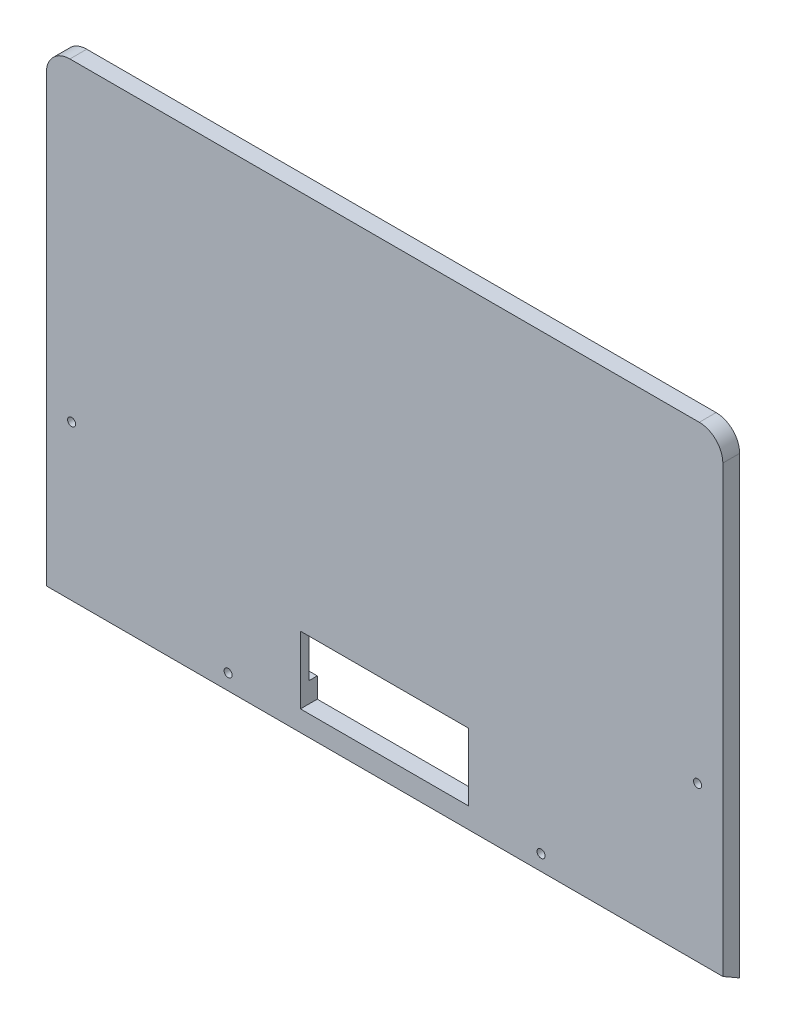
ISO-10303-21;
HEADER;
FILE_DESCRIPTION(('STEP AP214'),'2;1');
FILE_NAME('part.step','',(''),(''),'','','');
FILE_SCHEMA(('AUTOMOTIVE_DESIGN { 1 0 10303 214 1 1 1 1 }'));
ENDSEC;
DATA;
#1=APPLICATION_CONTEXT('core data for automotive mechanical design processes');
#2=APPLICATION_PROTOCOL_DEFINITION('international standard','automotive_design',2000,#1);
#3=PRODUCT_CONTEXT('',#1,'mechanical');
#4=PRODUCT('Part','Part','',(#3));
#5=PRODUCT_RELATED_PRODUCT_CATEGORY('part','',(#4));
#6=PRODUCT_DEFINITION_FORMATION('','',#4);
#7=PRODUCT_DEFINITION_CONTEXT('part definition',#1,'design');
#8=PRODUCT_DEFINITION('design','',#6,#7);
#9=PRODUCT_DEFINITION_SHAPE('','',#8);
#10=(LENGTH_UNIT() NAMED_UNIT(*) SI_UNIT(.MILLI.,.METRE.));
#11=(NAMED_UNIT(*) PLANE_ANGLE_UNIT() SI_UNIT($,.RADIAN.));
#12=(NAMED_UNIT(*) SI_UNIT($,.STERADIAN.) SOLID_ANGLE_UNIT());
#13=UNCERTAINTY_MEASURE_WITH_UNIT(LENGTH_MEASURE(1.E-05),#10,'distance_accuracy_value','');
#14=(GEOMETRIC_REPRESENTATION_CONTEXT(3) GLOBAL_UNCERTAINTY_ASSIGNED_CONTEXT((#13)) GLOBAL_UNIT_ASSIGNED_CONTEXT((#10,
#11,#12)) REPRESENTATION_CONTEXT('',''));
#15=CARTESIAN_POINT('',(0.,0.,0.));
#16=DIRECTION('',(0.,0.,1.));
#17=DIRECTION('',(1.,0.,0.));
#18=AXIS2_PLACEMENT_3D('',#15,#16,#17);
#19=CARTESIAN_POINT('',(0.,0.,0.));
#20=DIRECTION('',(0.,0.,1.));
#21=DIRECTION('',(1.,0.,0.));
#22=AXIS2_PLACEMENT_3D('',#19,#20,#21);
#23=PLANE('',#22);
#24=CARTESIAN_POINT('',(92.9999999999983,-22.1704481239277,0.));
#25=DIRECTION('',(0.,0.,-1.));
#26=DIRECTION('',(-1.,0.,0.));
#27=AXIS2_PLACEMENT_3D('',#24,#25,#26);
#28=CIRCLE('',#27,2.25);
#29=CARTESIAN_POINT('',(90.7499999999983,-22.1704481239277,0.));
#30=VERTEX_POINT('',#29);
#31=EDGE_CURVE('E737',#30,#30,#28,.T.);
#32=ORIENTED_EDGE('',*,*,#31,.F.);
#33=EDGE_LOOP('',(#32));
#34=FACE_BOUND('',#33,.T.);
#35=CARTESIAN_POINT('',(46.4999999999983,-63.4999999999987,0.));
#36=DIRECTION('',(0.,0.,-1.));
#37=DIRECTION('',(-1.,0.,0.));
#38=AXIS2_PLACEMENT_3D('',#35,#36,#37);
#39=CIRCLE('',#38,2.25);
#40=CARTESIAN_POINT('',(44.2499999999983,-63.4999999999987,0.));
#41=VERTEX_POINT('',#40);
#42=EDGE_CURVE('E730',#41,#41,#39,.T.);
#43=ORIENTED_EDGE('',*,*,#42,.F.);
#44=EDGE_LOOP('',(#43));
#45=FACE_BOUND('',#44,.T.);
#46=CARTESIAN_POINT('',(-46.5000000000017,-63.4999999999974,0.));
#47=DIRECTION('',(0.,0.,-1.));
#48=DIRECTION('',(-1.,0.,0.));
#49=AXIS2_PLACEMENT_3D('',#46,#47,#48);
#50=CIRCLE('',#49,2.25);
#51=CARTESIAN_POINT('',(-48.7500000000017,-63.4999999999974,0.));
#52=VERTEX_POINT('',#51);
#53=EDGE_CURVE('E748',#52,#52,#50,.T.);
#54=ORIENTED_EDGE('',*,*,#53,.F.);
#55=EDGE_LOOP('',(#54));
#56=FACE_BOUND('',#55,.T.);
#57=CARTESIAN_POINT('',(92.9999999999983,-63.5,0.));
#58=DIRECTION('',(0.,0.,-1.));
#59=DIRECTION('',(-1.,0.,0.));
#60=AXIS2_PLACEMENT_3D('',#57,#58,#59);
#61=CIRCLE('',#60,1.2);
#62=CARTESIAN_POINT('',(91.7999999999983,-63.5,0.));
#63=VERTEX_POINT('',#62);
#64=EDGE_CURVE('E344',#63,#63,#61,.T.);
#65=ORIENTED_EDGE('',*,*,#64,.F.);
#66=EDGE_LOOP('',(#65));
#67=FACE_BOUND('',#66,.T.);
#68=CARTESIAN_POINT('',(-93.0000000000017,-63.4999999999974,0.));
#69=DIRECTION('',(0.,0.,-1.));
#70=DIRECTION('',(-1.,0.,0.));
#71=AXIS2_PLACEMENT_3D('',#68,#69,#70);
#72=CIRCLE('',#71,1.2);
#73=CARTESIAN_POINT('',(-94.2000000000017,-63.4999999999974,0.));
#74=VERTEX_POINT('',#73);
#75=EDGE_CURVE('E363',#74,#74,#72,.T.);
#76=ORIENTED_EDGE('',*,*,#75,.F.);
#77=EDGE_LOOP('',(#76));
#78=FACE_BOUND('',#77,.T.);
#79=CARTESIAN_POINT('',(-93.,63.5000000000026,0.));
#80=DIRECTION('',(0.,0.,-1.));
#81=DIRECTION('',(-1.,0.,0.));
#82=AXIS2_PLACEMENT_3D('',#79,#80,#81);
#83=CIRCLE('',#82,1.2);
#84=CARTESIAN_POINT('',(-94.2,63.5000000000026,0.));
#85=VERTEX_POINT('',#84);
#86=EDGE_CURVE('E355',#85,#85,#83,.T.);
#87=ORIENTED_EDGE('',*,*,#86,.F.);
#88=EDGE_LOOP('',(#87));
#89=FACE_BOUND('',#88,.T.);
#90=CARTESIAN_POINT('',(93.,63.5,0.));
#91=DIRECTION('',(0.,0.,-1.));
#92=DIRECTION('',(-1.,0.,0.));
#93=AXIS2_PLACEMENT_3D('',#90,#91,#92);
#94=CIRCLE('',#93,1.2);
#95=CARTESIAN_POINT('',(91.8,63.5,0.));
#96=VERTEX_POINT('',#95);
#97=EDGE_CURVE('E354',#96,#96,#94,.T.);
#98=ORIENTED_EDGE('',*,*,#97,.F.);
#99=EDGE_LOOP('',(#98));
#100=FACE_BOUND('',#99,.T.);
#101=DIRECTION('',(-1.,0.,0.));
#102=VECTOR('',#101,1.);
#103=CARTESIAN_POINT('',(-100.5,71.,0.));
#104=LINE('',#103,#102);
#105=CARTESIAN_POINT('',(93.5000000000001,71.,0.));
#106=VERTEX_POINT('',#105);
#107=CARTESIAN_POINT('',(-93.4999999999999,71.,0.));
#108=VERTEX_POINT('',#107);
#109=EDGE_CURVE('E184',#106,#108,#104,.T.);
#110=ORIENTED_EDGE('',*,*,#109,.F.);
#111=CARTESIAN_POINT('',(93.5000000000001,64.,0.));
#112=DIRECTION('',(0.,0.,1.));
#113=DIRECTION('',(1.,0.,0.));
#114=AXIS2_PLACEMENT_3D('',#111,#112,#113);
#115=CIRCLE('',#114,7.);
#116=CARTESIAN_POINT('',(100.5,64.,0.));
#117=VERTEX_POINT('',#116);
#118=EDGE_CURVE('E182',#106,#117,#115,.F.);
#119=ORIENTED_EDGE('',*,*,#118,.T.);
#120=DIRECTION('',(0.,1.,0.));
#121=VECTOR('',#120,1.);
#122=CARTESIAN_POINT('',(100.5,71.,0.));
#123=LINE('',#122,#121);
#124=CARTESIAN_POINT('',(100.5,-71.,0.));
#125=VERTEX_POINT('',#124);
#126=EDGE_CURVE('E176',#125,#117,#123,.T.);
#127=ORIENTED_EDGE('',*,*,#126,.F.);
#128=DIRECTION('',(1.,0.,0.));
#129=VECTOR('',#128,1.);
#130=CARTESIAN_POINT('',(-100.5,-71.,0.));
#131=LINE('',#130,#129);
#132=CARTESIAN_POINT('',(-100.5,-71.,0.));
#133=VERTEX_POINT('',#132);
#134=EDGE_CURVE('E160',#133,#125,#131,.T.);
#135=ORIENTED_EDGE('',*,*,#134,.F.);
#136=DIRECTION('',(0.,-1.,0.));
#137=VECTOR('',#136,1.);
#138=CARTESIAN_POINT('',(-100.5,71.,0.));
#139=LINE('',#138,#137);
#140=CARTESIAN_POINT('',(-100.5,64.,0.));
#141=VERTEX_POINT('',#140);
#142=EDGE_CURVE('E173',#141,#133,#139,.T.);
#143=ORIENTED_EDGE('',*,*,#142,.F.);
#144=CARTESIAN_POINT('',(-93.4999999999999,64.,0.));
#145=DIRECTION('',(0.,0.,1.));
#146=DIRECTION('',(1.,0.,0.));
#147=AXIS2_PLACEMENT_3D('',#144,#145,#146);
#148=CIRCLE('',#147,7.);
#149=EDGE_CURVE('E220',#141,#108,#148,.F.);
#150=ORIENTED_EDGE('',*,*,#149,.T.);
#151=EDGE_LOOP('',(#110,#119,#127,#135,#143,#150));
#152=FACE_BOUND('',#151,.T.);
#153=DIRECTION('',(0.,1.,0.));
#154=VECTOR('',#153,1.);
#155=CARTESIAN_POINT('',(25.,-62.,0.));
#156=LINE('',#155,#154);
#157=CARTESIAN_POINT('',(25.,-62.,0.));
#158=VERTEX_POINT('',#157);
#159=CARTESIAN_POINT('',(25.,-56.,0.));
#160=VERTEX_POINT('',#159);
#161=EDGE_CURVE('E378',#158,#160,#156,.T.);
#162=ORIENTED_EDGE('',*,*,#161,.T.);
#163=DIRECTION('',(1.,0.,0.));
#164=VECTOR('',#163,1.);
#165=CARTESIAN_POINT('',(-85.5,-56.,0.));
#166=LINE('',#165,#164);
#167=CARTESIAN_POINT('',(85.5,-56.,0.));
#168=VERTEX_POINT('',#167);
#169=EDGE_CURVE('E321',#160,#168,#166,.T.);
#170=ORIENTED_EDGE('',*,*,#169,.T.);
#171=DIRECTION('',(0.,1.,0.));
#172=VECTOR('',#171,1.);
#173=CARTESIAN_POINT('',(85.5,56.,0.));
#174=LINE('',#173,#172);
#175=CARTESIAN_POINT('',(85.5,56.,0.));
#176=VERTEX_POINT('',#175);
#177=EDGE_CURVE('E308',#168,#176,#174,.T.);
#178=ORIENTED_EDGE('',*,*,#177,.T.);
#179=DIRECTION('',(-1.,0.,0.));
#180=VECTOR('',#179,1.);
#181=CARTESIAN_POINT('',(-85.5,56.,0.));
#182=LINE('',#181,#180);
#183=CARTESIAN_POINT('',(-85.5,56.,0.));
#184=VERTEX_POINT('',#183);
#185=EDGE_CURVE('E316',#176,#184,#182,.T.);
#186=ORIENTED_EDGE('',*,*,#185,.T.);
#187=DIRECTION('',(0.,-1.,0.));
#188=VECTOR('',#187,1.);
#189=CARTESIAN_POINT('',(-85.5,56.,0.));
#190=LINE('',#189,#188);
#191=CARTESIAN_POINT('',(-85.5,-56.,0.));
#192=VERTEX_POINT('',#191);
#193=EDGE_CURVE('E435',#184,#192,#190,.T.);
#194=ORIENTED_EDGE('',*,*,#193,.T.);
#195=CARTESIAN_POINT('',(-25.,-56.,0.));
#196=VERTEX_POINT('',#195);
#197=EDGE_CURVE('E334',#192,#196,#166,.T.);
#198=ORIENTED_EDGE('',*,*,#197,.T.);
#199=DIRECTION('',(0.,-1.,0.));
#200=VECTOR('',#199,1.);
#201=CARTESIAN_POINT('',(-25.,-62.,0.));
#202=LINE('',#201,#200);
#203=CARTESIAN_POINT('',(-25.,-62.,0.));
#204=VERTEX_POINT('',#203);
#205=EDGE_CURVE('E385',#196,#204,#202,.T.);
#206=ORIENTED_EDGE('',*,*,#205,.T.);
#207=DIRECTION('',(1.,0.,0.));
#208=VECTOR('',#207,1.);
#209=CARTESIAN_POINT('',(-25.,-62.,0.));
#210=LINE('',#209,#208);
#211=EDGE_CURVE('E389',#204,#158,#210,.T.);
#212=ORIENTED_EDGE('',*,*,#211,.T.);
#213=EDGE_LOOP('',(#162,#170,#178,#186,#194,#198,#206,#212));
#214=FACE_BOUND('',#213,.T.);
#215=CARTESIAN_POINT('',(-93.0000000000017,-22.1704481239277,0.));
#216=DIRECTION('',(0.,0.,-1.));
#217=DIRECTION('',(-1.,0.,0.));
#218=AXIS2_PLACEMENT_3D('',#215,#216,#217);
#219=CIRCLE('',#218,2.25);
#220=CARTESIAN_POINT('',(-95.2500000000017,-22.1704481239277,0.));
#221=VERTEX_POINT('',#220);
#222=EDGE_CURVE('E760',#221,#221,#219,.T.);
#223=ORIENTED_EDGE('',*,*,#222,.F.);
#224=EDGE_LOOP('',(#223));
#225=FACE_BOUND('',#224,.T.);
#226=ADVANCED_FACE('F43',(#34,#45,#56,#67,#78,#89,#100,#152,#214,#225),#23,.F.);
#227=CARTESIAN_POINT('',(0.,0.,5.));
#228=DIRECTION('',(0.,0.,1.));
#229=DIRECTION('',(1.,0.,0.));
#230=AXIS2_PLACEMENT_3D('',#227,#228,#229);
#231=PLANE('',#230);
#232=CARTESIAN_POINT('',(92.9999999999983,-22.1704481239277,5.));
#233=DIRECTION('',(0.,0.,1.));
#234=DIRECTION('',(1.,0.,0.));
#235=AXIS2_PLACEMENT_3D('',#232,#233,#234);
#236=CIRCLE('',#235,1.19999999999999);
#237=CARTESIAN_POINT('',(94.1999999999983,-22.1704481239277,5.));
#238=VERTEX_POINT('',#237);
#239=EDGE_CURVE('E728',#238,#238,#236,.T.);
#240=ORIENTED_EDGE('',*,*,#239,.F.);
#241=EDGE_LOOP('',(#240));
#242=FACE_BOUND('',#241,.T.);
#243=CARTESIAN_POINT('',(46.4999999999983,-63.4999999999987,5.));
#244=DIRECTION('',(0.,0.,1.));
#245=DIRECTION('',(1.,0.,0.));
#246=AXIS2_PLACEMENT_3D('',#243,#244,#245);
#247=CIRCLE('',#246,1.2);
#248=CARTESIAN_POINT('',(47.6999999999983,-63.4999999999987,5.));
#249=VERTEX_POINT('',#248);
#250=EDGE_CURVE('E744',#249,#249,#247,.T.);
#251=ORIENTED_EDGE('',*,*,#250,.F.);
#252=EDGE_LOOP('',(#251));
#253=FACE_BOUND('',#252,.T.);
#254=CARTESIAN_POINT('',(-46.5000000000017,-63.4999999999974,5.));
#255=DIRECTION('',(0.,0.,1.));
#256=DIRECTION('',(1.,0.,0.));
#257=AXIS2_PLACEMENT_3D('',#254,#255,#256);
#258=CIRCLE('',#257,1.2);
#259=CARTESIAN_POINT('',(-45.3000000000017,-63.4999999999974,5.));
#260=VERTEX_POINT('',#259);
#261=EDGE_CURVE('E756',#260,#260,#258,.T.);
#262=ORIENTED_EDGE('',*,*,#261,.F.);
#263=EDGE_LOOP('',(#262));
#264=FACE_BOUND('',#263,.T.);
#265=CARTESIAN_POINT('',(-93.0000000000017,-22.1704481239277,5.));
#266=DIRECTION('',(0.,0.,1.));
#267=DIRECTION('',(1.,0.,0.));
#268=AXIS2_PLACEMENT_3D('',#265,#266,#267);
#269=CIRCLE('',#268,1.19999999999999);
#270=CARTESIAN_POINT('',(-91.8000000000017,-22.1704481239277,5.));
#271=VERTEX_POINT('',#270);
#272=EDGE_CURVE('E178',#271,#271,#269,.T.);
#273=ORIENTED_EDGE('',*,*,#272,.F.);
#274=EDGE_LOOP('',(#273));
#275=FACE_BOUND('',#274,.T.);
#276=DIRECTION('',(0.,1.,0.));
#277=VECTOR('',#276,1.);
#278=CARTESIAN_POINT('',(100.5,71.,5.));
#279=LINE('',#278,#277);
#280=CARTESIAN_POINT('',(100.5,-68.1132486540519,5.));
#281=VERTEX_POINT('',#280);
#282=CARTESIAN_POINT('',(100.5,64.,5.));
#283=VERTEX_POINT('',#282);
#284=EDGE_CURVE('E172',#281,#283,#279,.T.);
#285=ORIENTED_EDGE('',*,*,#284,.T.);
#286=CARTESIAN_POINT('',(93.5000000000001,64.,5.));
#287=DIRECTION('',(0.,0.,1.));
#288=DIRECTION('',(1.,0.,0.));
#289=AXIS2_PLACEMENT_3D('',#286,#287,#288);
#290=CIRCLE('',#289,7.);
#291=CARTESIAN_POINT('',(93.5000000000001,71.,5.));
#292=VERTEX_POINT('',#291);
#293=EDGE_CURVE('E52',#283,#292,#290,.T.);
#294=ORIENTED_EDGE('',*,*,#293,.T.);
#295=DIRECTION('',(-1.,0.,0.));
#296=VECTOR('',#295,1.);
#297=CARTESIAN_POINT('',(-100.5,71.,5.));
#298=LINE('',#297,#296);
#299=CARTESIAN_POINT('',(-93.4999999999999,71.,5.));
#300=VERTEX_POINT('',#299);
#301=EDGE_CURVE('E233',#292,#300,#298,.T.);
#302=ORIENTED_EDGE('',*,*,#301,.T.);
#303=CARTESIAN_POINT('',(-93.4999999999999,64.,5.));
#304=DIRECTION('',(0.,0.,1.));
#305=DIRECTION('',(1.,0.,0.));
#306=AXIS2_PLACEMENT_3D('',#303,#304,#305);
#307=CIRCLE('',#306,7.);
#308=CARTESIAN_POINT('',(-100.5,64.,5.));
#309=VERTEX_POINT('',#308);
#310=EDGE_CURVE('E59',#300,#309,#307,.T.);
#311=ORIENTED_EDGE('',*,*,#310,.T.);
#312=DIRECTION('',(0.,-1.,0.));
#313=VECTOR('',#312,1.);
#314=CARTESIAN_POINT('',(-100.5,71.,5.));
#315=LINE('',#314,#313);
#316=CARTESIAN_POINT('',(-100.5,-68.1132486540519,5.));
#317=VERTEX_POINT('',#316);
#318=EDGE_CURVE('E195',#309,#317,#315,.T.);
#319=ORIENTED_EDGE('',*,*,#318,.T.);
#320=DIRECTION('',(-1.,0.,0.));
#321=VECTOR('',#320,1.);
#322=CARTESIAN_POINT('',(100.501,-68.1132486540519,5.));
#323=LINE('',#322,#321);
#324=EDGE_CURVE('E341',#281,#317,#323,.T.);
#325=ORIENTED_EDGE('',*,*,#324,.F.);
#326=EDGE_LOOP('',(#285,#294,#302,#311,#319,#325));
#327=FACE_BOUND('',#326,.T.);
#328=DIRECTION('',(1.,0.,0.));
#329=VECTOR('',#328,1.);
#330=CARTESIAN_POINT('',(0.,-42.,5.));
#331=LINE('',#330,#329);
#332=CARTESIAN_POINT('',(-25.,-42.,5.));
#333=VERTEX_POINT('',#332);
#334=CARTESIAN_POINT('',(25.,-42.,5.));
#335=VERTEX_POINT('',#334);
#336=EDGE_CURVE('E415',#333,#335,#331,.T.);
#337=ORIENTED_EDGE('',*,*,#336,.T.);
#338=DIRECTION('',(0.,-1.,0.));
#339=VECTOR('',#338,1.);
#340=CARTESIAN_POINT('',(25.,0.,5.));
#341=LINE('',#340,#339);
#342=CARTESIAN_POINT('',(25.,-62.,5.));
#343=VERTEX_POINT('',#342);
#344=EDGE_CURVE('E317',#335,#343,#341,.T.);
#345=ORIENTED_EDGE('',*,*,#344,.T.);
#346=DIRECTION('',(-1.,0.,0.));
#347=VECTOR('',#346,1.);
#348=CARTESIAN_POINT('',(0.,-62.,5.));
#349=LINE('',#348,#347);
#350=CARTESIAN_POINT('',(-25.,-62.,5.));
#351=VERTEX_POINT('',#350);
#352=EDGE_CURVE('E209',#343,#351,#349,.T.);
#353=ORIENTED_EDGE('',*,*,#352,.T.);
#354=DIRECTION('',(0.,1.,0.));
#355=VECTOR('',#354,1.);
#356=CARTESIAN_POINT('',(-25.,0.,5.));
#357=LINE('',#356,#355);
#358=EDGE_CURVE('E411',#351,#333,#357,.T.);
#359=ORIENTED_EDGE('',*,*,#358,.T.);
#360=EDGE_LOOP('',(#337,#345,#353,#359));
#361=FACE_BOUND('',#360,.T.);
#362=ADVANCED_FACE('F231',(#242,#253,#264,#275,#327,#361),#231,.T.);
#363=CARTESIAN_POINT('',(-85.5,-56.,2.5));
#364=DIRECTION('',(0.,1.,0.));
#365=DIRECTION('',(0.,0.,1.));
#366=AXIS2_PLACEMENT_3D('',#363,#364,#365);
#367=PLANE('',#366);
#368=ORIENTED_EDGE('',*,*,#169,.F.);
#369=DIRECTION('',(0.,0.,1.));
#370=VECTOR('',#369,1.);
#371=CARTESIAN_POINT('',(25.,-56.,2.5));
#372=LINE('',#371,#370);
#373=CARTESIAN_POINT('',(25.,-56.,2.5));
#374=VERTEX_POINT('',#373);
#375=EDGE_CURVE('E419',#160,#374,#372,.T.);
#376=ORIENTED_EDGE('',*,*,#375,.T.);
#377=DIRECTION('',(1.,0.,0.));
#378=VECTOR('',#377,1.);
#379=CARTESIAN_POINT('',(-85.5,-56.,2.5));
#380=LINE('',#379,#378);
#381=CARTESIAN_POINT('',(85.5,-56.,2.5));
#382=VERTEX_POINT('',#381);
#383=EDGE_CURVE('E323',#374,#382,#380,.T.);
#384=ORIENTED_EDGE('',*,*,#383,.T.);
#385=DIRECTION('',(0.,0.,-1.));
#386=VECTOR('',#385,1.);
#387=CARTESIAN_POINT('',(85.5,-56.,2.5));
#388=LINE('',#387,#386);
#389=EDGE_CURVE('E311',#382,#168,#388,.T.);
#390=ORIENTED_EDGE('',*,*,#389,.T.);
#391=EDGE_LOOP('',(#368,#376,#384,#390));
#392=FACE_BOUND('',#391,.T.);
#393=ADVANCED_FACE('F259',(#392),#367,.T.);
#394=CARTESIAN_POINT('',(-85.5,-56.,2.5));
#395=VERTEX_POINT('',#394);
#396=CARTESIAN_POINT('',(-25.,-56.,2.5));
#397=VERTEX_POINT('',#396);
#398=EDGE_CURVE('E326',#395,#397,#380,.T.);
#399=ORIENTED_EDGE('',*,*,#398,.T.);
#400=DIRECTION('',(0.,0.,-1.));
#401=VECTOR('',#400,1.);
#402=CARTESIAN_POINT('',(-25.,-56.,2.5));
#403=LINE('',#402,#401);
#404=EDGE_CURVE('E407',#397,#196,#403,.T.);
#405=ORIENTED_EDGE('',*,*,#404,.T.);
#406=ORIENTED_EDGE('',*,*,#197,.F.);
#407=DIRECTION('',(0.,0.,-1.));
#408=VECTOR('',#407,1.);
#409=CARTESIAN_POINT('',(-85.5,-56.,2.5));
#410=LINE('',#409,#408);
#411=EDGE_CURVE('E325',#395,#192,#410,.T.);
#412=ORIENTED_EDGE('',*,*,#411,.F.);
#413=EDGE_LOOP('',(#399,#405,#406,#412));
#414=FACE_BOUND('',#413,.T.);
#415=ADVANCED_FACE('F277',(#414),#367,.T.);
#416=CARTESIAN_POINT('',(0.,0.,2.5));
#417=DIRECTION('',(0.,0.,1.));
#418=DIRECTION('',(1.,0.,0.));
#419=AXIS2_PLACEMENT_3D('',#416,#417,#418);
#420=PLANE('',#419);
#421=DIRECTION('',(0.,-1.,0.));
#422=VECTOR('',#421,1.);
#423=CARTESIAN_POINT('',(25.,0.,2.5));
#424=LINE('',#423,#422);
#425=CARTESIAN_POINT('',(25.,-42.,2.5));
#426=VERTEX_POINT('',#425);
#427=EDGE_CURVE('E206',#426,#374,#424,.T.);
#428=ORIENTED_EDGE('',*,*,#427,.F.);
#429=DIRECTION('',(1.,0.,0.));
#430=VECTOR('',#429,1.);
#431=CARTESIAN_POINT('',(0.,-42.,2.5));
#432=LINE('',#431,#430);
#433=CARTESIAN_POINT('',(-25.,-42.,2.5));
#434=VERTEX_POINT('',#433);
#435=EDGE_CURVE('E203',#434,#426,#432,.T.);
#436=ORIENTED_EDGE('',*,*,#435,.F.);
#437=DIRECTION('',(0.,1.,0.));
#438=VECTOR('',#437,1.);
#439=CARTESIAN_POINT('',(-25.,0.,2.5));
#440=LINE('',#439,#438);
#441=EDGE_CURVE('E200',#397,#434,#440,.T.);
#442=ORIENTED_EDGE('',*,*,#441,.F.);
#443=ORIENTED_EDGE('',*,*,#398,.F.);
#444=DIRECTION('',(0.,-1.,0.));
#445=VECTOR('',#444,1.);
#446=CARTESIAN_POINT('',(-85.5,56.,2.5));
#447=LINE('',#446,#445);
#448=CARTESIAN_POINT('',(-85.5,56.,2.5));
#449=VERTEX_POINT('',#448);
#450=EDGE_CURVE('E431',#449,#395,#447,.T.);
#451=ORIENTED_EDGE('',*,*,#450,.F.);
#452=DIRECTION('',(-1.,0.,0.));
#453=VECTOR('',#452,1.);
#454=CARTESIAN_POINT('',(-85.5,56.,2.5));
#455=LINE('',#454,#453);
#456=CARTESIAN_POINT('',(85.5,56.,2.5));
#457=VERTEX_POINT('',#456);
#458=EDGE_CURVE('E428',#457,#449,#455,.T.);
#459=ORIENTED_EDGE('',*,*,#458,.F.);
#460=DIRECTION('',(0.,1.,0.));
#461=VECTOR('',#460,1.);
#462=CARTESIAN_POINT('',(85.5,56.,2.5));
#463=LINE('',#462,#461);
#464=EDGE_CURVE('E425',#382,#457,#463,.T.);
#465=ORIENTED_EDGE('',*,*,#464,.F.);
#466=ORIENTED_EDGE('',*,*,#383,.F.);
#467=EDGE_LOOP('',(#428,#436,#442,#443,#451,#459,#465,#466));
#468=FACE_BOUND('',#467,.T.);
#469=ADVANCED_FACE('F273',(#468),#420,.F.);
#470=CARTESIAN_POINT('',(100.5,71.,5.));
#471=DIRECTION('',(-1.,0.,0.));
#472=DIRECTION('',(0.,-1.,0.));
#473=AXIS2_PLACEMENT_3D('',#470,#471,#472);
#474=PLANE('',#473);
#475=ORIENTED_EDGE('',*,*,#126,.T.);
#476=DIRECTION('',(0.,0.,-1.));
#477=VECTOR('',#476,1.);
#478=CARTESIAN_POINT('',(100.5,64.,5.));
#479=LINE('',#478,#477);
#480=EDGE_CURVE('E67',#117,#283,#479,.F.);
#481=ORIENTED_EDGE('',*,*,#480,.T.);
#482=ORIENTED_EDGE('',*,*,#284,.F.);
#483=DIRECTION('',(0.,0.499999999999996,0.866025403784441));
#484=VECTOR('',#483,1.);
#485=CARTESIAN_POINT('',(100.5,-68.1132486540519,5.));
#486=LINE('',#485,#484);
#487=EDGE_CURVE('E164',#125,#281,#486,.T.);
#488=ORIENTED_EDGE('',*,*,#487,.F.);
#489=EDGE_LOOP('',(#475,#481,#482,#488));
#490=FACE_BOUND('',#489,.T.);
#491=ADVANCED_FACE('F175',(#490),#474,.F.);
#492=CARTESIAN_POINT('',(-100.5,71.,5.));
#493=DIRECTION('',(0.,-1.,0.));
#494=DIRECTION('',(0.,0.,-1.));
#495=AXIS2_PLACEMENT_3D('',#492,#493,#494);
#496=PLANE('',#495);
#497=ORIENTED_EDGE('',*,*,#301,.F.);
#498=DIRECTION('',(0.,0.,-1.));
#499=VECTOR('',#498,1.);
#500=CARTESIAN_POINT('',(93.5000000000001,71.,5.));
#501=LINE('',#500,#499);
#502=EDGE_CURVE('E216',#292,#106,#501,.T.);
#503=ORIENTED_EDGE('',*,*,#502,.T.);
#504=ORIENTED_EDGE('',*,*,#109,.T.);
#505=DIRECTION('',(0.,0.,-1.));
#506=VECTOR('',#505,1.);
#507=CARTESIAN_POINT('',(-93.4999999999999,71.,5.));
#508=LINE('',#507,#506);
#509=EDGE_CURVE('E213',#108,#300,#508,.F.);
#510=ORIENTED_EDGE('',*,*,#509,.T.);
#511=EDGE_LOOP('',(#497,#503,#504,#510));
#512=FACE_BOUND('',#511,.T.);
#513=ADVANCED_FACE('F237',(#512),#496,.F.);
#514=CARTESIAN_POINT('',(-100.5,71.,5.));
#515=DIRECTION('',(1.,0.,0.));
#516=DIRECTION('',(0.,1.,0.));
#517=AXIS2_PLACEMENT_3D('',#514,#515,#516);
#518=PLANE('',#517);
#519=ORIENTED_EDGE('',*,*,#318,.F.);
#520=DIRECTION('',(0.,0.,-1.));
#521=VECTOR('',#520,1.);
#522=CARTESIAN_POINT('',(-100.5,64.,5.));
#523=LINE('',#522,#521);
#524=EDGE_CURVE('E11',#309,#141,#523,.T.);
#525=ORIENTED_EDGE('',*,*,#524,.T.);
#526=ORIENTED_EDGE('',*,*,#142,.T.);
#527=DIRECTION('',(0.,-0.499999999999996,-0.866025403784441));
#528=VECTOR('',#527,1.);
#529=CARTESIAN_POINT('',(-100.5,-68.1132486540519,5.));
#530=LINE('',#529,#528);
#531=EDGE_CURVE('E167',#317,#133,#530,.T.);
#532=ORIENTED_EDGE('',*,*,#531,.F.);
#533=EDGE_LOOP('',(#519,#525,#526,#532));
#534=FACE_BOUND('',#533,.T.);
#535=ADVANCED_FACE('F266',(#534),#518,.F.);
#536=CARTESIAN_POINT('',(85.5,56.,2.5));
#537=DIRECTION('',(-1.,0.,0.));
#538=DIRECTION('',(0.,0.,1.));
#539=AXIS2_PLACEMENT_3D('',#536,#537,#538);
#540=PLANE('',#539);
#541=ORIENTED_EDGE('',*,*,#177,.F.);
#542=ORIENTED_EDGE('',*,*,#389,.F.);
#543=ORIENTED_EDGE('',*,*,#464,.T.);
#544=DIRECTION('',(0.,0.,-1.));
#545=VECTOR('',#544,1.);
#546=CARTESIAN_POINT('',(85.5,56.,2.5));
#547=LINE('',#546,#545);
#548=EDGE_CURVE('E185',#457,#176,#547,.T.);
#549=ORIENTED_EDGE('',*,*,#548,.T.);
#550=EDGE_LOOP('',(#541,#542,#543,#549));
#551=FACE_BOUND('',#550,.T.);
#552=ADVANCED_FACE('F269',(#551),#540,.T.);
#553=CARTESIAN_POINT('',(-85.5,56.,2.5));
#554=DIRECTION('',(0.,-1.,0.));
#555=DIRECTION('',(0.,0.,-1.));
#556=AXIS2_PLACEMENT_3D('',#553,#554,#555);
#557=PLANE('',#556);
#558=ORIENTED_EDGE('',*,*,#185,.F.);
#559=ORIENTED_EDGE('',*,*,#548,.F.);
#560=ORIENTED_EDGE('',*,*,#458,.T.);
#561=DIRECTION('',(0.,0.,-1.));
#562=VECTOR('',#561,1.);
#563=CARTESIAN_POINT('',(-85.5,56.,2.5));
#564=LINE('',#563,#562);
#565=EDGE_CURVE('E192',#449,#184,#564,.T.);
#566=ORIENTED_EDGE('',*,*,#565,.T.);
#567=EDGE_LOOP('',(#558,#559,#560,#566));
#568=FACE_BOUND('',#567,.T.);
#569=ADVANCED_FACE('F296',(#568),#557,.T.);
#570=CARTESIAN_POINT('',(-85.5,56.,2.5));
#571=DIRECTION('',(1.,0.,0.));
#572=DIRECTION('',(0.,0.,-1.));
#573=AXIS2_PLACEMENT_3D('',#570,#571,#572);
#574=PLANE('',#573);
#575=ORIENTED_EDGE('',*,*,#193,.F.);
#576=ORIENTED_EDGE('',*,*,#565,.F.);
#577=ORIENTED_EDGE('',*,*,#450,.T.);
#578=ORIENTED_EDGE('',*,*,#411,.T.);
#579=EDGE_LOOP('',(#575,#576,#577,#578));
#580=FACE_BOUND('',#579,.T.);
#581=ADVANCED_FACE('F292',(#580),#574,.T.);
#582=CARTESIAN_POINT('',(-25.,-42.,15.));
#583=DIRECTION('',(0.,-1.,0.));
#584=DIRECTION('',(0.,0.,-1.));
#585=AXIS2_PLACEMENT_3D('',#582,#583,#584);
#586=PLANE('',#585);
#587=DIRECTION('',(0.,0.,-1.));
#588=VECTOR('',#587,1.);
#589=CARTESIAN_POINT('',(-25.,-42.,15.));
#590=LINE('',#589,#588);
#591=EDGE_CURVE('E399',#333,#434,#590,.T.);
#592=ORIENTED_EDGE('',*,*,#591,.T.);
#593=ORIENTED_EDGE('',*,*,#435,.T.);
#594=DIRECTION('',(0.,0.,-1.));
#595=VECTOR('',#594,1.);
#596=CARTESIAN_POINT('',(25.,-42.,15.));
#597=LINE('',#596,#595);
#598=EDGE_CURVE('E403',#335,#426,#597,.T.);
#599=ORIENTED_EDGE('',*,*,#598,.F.);
#600=ORIENTED_EDGE('',*,*,#336,.F.);
#601=EDGE_LOOP('',(#592,#593,#599,#600));
#602=FACE_BOUND('',#601,.T.);
#603=ADVANCED_FACE('F295',(#602),#586,.T.);
#604=CARTESIAN_POINT('',(25.,-62.,15.));
#605=DIRECTION('',(-1.,0.,0.));
#606=DIRECTION('',(0.,0.,1.));
#607=AXIS2_PLACEMENT_3D('',#604,#605,#606);
#608=PLANE('',#607);
#609=ORIENTED_EDGE('',*,*,#598,.T.);
#610=ORIENTED_EDGE('',*,*,#427,.T.);
#611=ORIENTED_EDGE('',*,*,#375,.F.);
#612=ORIENTED_EDGE('',*,*,#161,.F.);
#613=DIRECTION('',(0.,0.,-1.));
#614=VECTOR('',#613,1.);
#615=CARTESIAN_POINT('',(25.,-62.,15.));
#616=LINE('',#615,#614);
#617=EDGE_CURVE('E393',#343,#158,#616,.T.);
#618=ORIENTED_EDGE('',*,*,#617,.F.);
#619=ORIENTED_EDGE('',*,*,#344,.F.);
#620=EDGE_LOOP('',(#609,#610,#611,#612,#618,#619));
#621=FACE_BOUND('',#620,.T.);
#622=ADVANCED_FACE('F287',(#621),#608,.T.);
#623=CARTESIAN_POINT('',(-25.,-62.,15.));
#624=DIRECTION('',(1.,0.,0.));
#625=DIRECTION('',(0.,0.,-1.));
#626=AXIS2_PLACEMENT_3D('',#623,#624,#625);
#627=PLANE('',#626);
#628=DIRECTION('',(0.,0.,-1.));
#629=VECTOR('',#628,1.);
#630=CARTESIAN_POINT('',(-25.,-62.,15.));
#631=LINE('',#630,#629);
#632=EDGE_CURVE('E396',#351,#204,#631,.T.);
#633=ORIENTED_EDGE('',*,*,#632,.T.);
#634=ORIENTED_EDGE('',*,*,#205,.F.);
#635=ORIENTED_EDGE('',*,*,#404,.F.);
#636=ORIENTED_EDGE('',*,*,#441,.T.);
#637=ORIENTED_EDGE('',*,*,#591,.F.);
#638=ORIENTED_EDGE('',*,*,#358,.F.);
#639=EDGE_LOOP('',(#633,#634,#635,#636,#637,#638));
#640=FACE_BOUND('',#639,.T.);
#641=ADVANCED_FACE('F448',(#640),#627,.T.);
#642=CARTESIAN_POINT('',(-25.,-62.,15.));
#643=DIRECTION('',(0.,1.,0.));
#644=DIRECTION('',(0.,0.,1.));
#645=AXIS2_PLACEMENT_3D('',#642,#643,#644);
#646=PLANE('',#645);
#647=ORIENTED_EDGE('',*,*,#617,.T.);
#648=ORIENTED_EDGE('',*,*,#211,.F.);
#649=ORIENTED_EDGE('',*,*,#632,.F.);
#650=ORIENTED_EDGE('',*,*,#352,.F.);
#651=EDGE_LOOP('',(#647,#648,#649,#650));
#652=FACE_BOUND('',#651,.T.);
#653=ADVANCED_FACE('F460',(#652),#646,.T.);
#654=CARTESIAN_POINT('',(93.,63.5,3.));
#655=DIRECTION('',(0.,0.,-1.));
#656=DIRECTION('',(-1.,0.,0.));
#657=AXIS2_PLACEMENT_3D('',#654,#655,#656);
#658=CYLINDRICAL_SURFACE('',#657,1.2);
#659=CARTESIAN_POINT('',(93.,63.5,3.));
#660=DIRECTION('',(0.,0.,-1.));
#661=DIRECTION('',(-1.,0.,0.));
#662=AXIS2_PLACEMENT_3D('',#659,#660,#661);
#663=CIRCLE('',#662,1.2);
#664=CARTESIAN_POINT('',(91.8,63.5,3.));
#665=VERTEX_POINT('',#664);
#666=EDGE_CURVE('E374',#665,#665,#663,.T.);
#667=ORIENTED_EDGE('',*,*,#666,.F.);
#668=EDGE_LOOP('',(#667));
#669=FACE_BOUND('',#668,.T.);
#670=ORIENTED_EDGE('',*,*,#97,.T.);
#671=EDGE_LOOP('',(#670));
#672=FACE_BOUND('',#671,.T.);
#673=ADVANCED_FACE('F464',(#669,#672),#658,.F.);
#674=CARTESIAN_POINT('',(93.,63.5,3.));
#675=DIRECTION('',(0.,0.,-1.));
#676=DIRECTION('',(-1.,0.,0.));
#677=AXIS2_PLACEMENT_3D('',#674,#675,#676);
#678=PLANE('',#677);
#679=ORIENTED_EDGE('',*,*,#666,.T.);
#680=EDGE_LOOP('',(#679));
#681=FACE_BOUND('',#680,.T.);
#682=ADVANCED_FACE('F470',(#681),#678,.T.);
#683=CARTESIAN_POINT('',(-93.,63.5000000000026,3.));
#684=DIRECTION('',(0.,0.,-1.));
#685=DIRECTION('',(-1.,0.,0.));
#686=AXIS2_PLACEMENT_3D('',#683,#684,#685);
#687=CYLINDRICAL_SURFACE('',#686,1.2);
#688=CARTESIAN_POINT('',(-93.,63.5000000000026,3.));
#689=DIRECTION('',(0.,0.,-1.));
#690=DIRECTION('',(-1.,0.,0.));
#691=AXIS2_PLACEMENT_3D('',#688,#689,#690);
#692=CIRCLE('',#691,1.2);
#693=CARTESIAN_POINT('',(-94.2,63.5000000000026,3.));
#694=VERTEX_POINT('',#693);
#695=EDGE_CURVE('E350',#694,#694,#692,.T.);
#696=ORIENTED_EDGE('',*,*,#695,.F.);
#697=EDGE_LOOP('',(#696));
#698=FACE_BOUND('',#697,.T.);
#699=ORIENTED_EDGE('',*,*,#86,.T.);
#700=EDGE_LOOP('',(#699));
#701=FACE_BOUND('',#700,.T.);
#702=ADVANCED_FACE('F504',(#698,#701),#687,.F.);
#703=CARTESIAN_POINT('',(-93.,63.5000000000026,3.));
#704=DIRECTION('',(0.,0.,-1.));
#705=DIRECTION('',(-1.,0.,0.));
#706=AXIS2_PLACEMENT_3D('',#703,#704,#705);
#707=PLANE('',#706);
#708=ORIENTED_EDGE('',*,*,#695,.T.);
#709=EDGE_LOOP('',(#708));
#710=FACE_BOUND('',#709,.T.);
#711=ADVANCED_FACE('F513',(#710),#707,.T.);
#712=CARTESIAN_POINT('',(-93.0000000000017,-63.4999999999974,3.));
#713=DIRECTION('',(0.,0.,-1.));
#714=DIRECTION('',(-1.,0.,0.));
#715=AXIS2_PLACEMENT_3D('',#712,#713,#714);
#716=CYLINDRICAL_SURFACE('',#715,1.2);
#717=CARTESIAN_POINT('',(-93.0000000000017,-63.4999999999974,3.));
#718=DIRECTION('',(0.,0.,-1.));
#719=DIRECTION('',(-1.,0.,0.));
#720=AXIS2_PLACEMENT_3D('',#717,#718,#719);
#721=CIRCLE('',#720,1.2);
#722=CARTESIAN_POINT('',(-94.2000000000017,-63.4999999999974,3.));
#723=VERTEX_POINT('',#722);
#724=EDGE_CURVE('E359',#723,#723,#721,.T.);
#725=ORIENTED_EDGE('',*,*,#724,.F.);
#726=EDGE_LOOP('',(#725));
#727=FACE_BOUND('',#726,.T.);
#728=ORIENTED_EDGE('',*,*,#75,.T.);
#729=EDGE_LOOP('',(#728));
#730=FACE_BOUND('',#729,.T.);
#731=ADVANCED_FACE('F523',(#727,#730),#716,.F.);
#732=CARTESIAN_POINT('',(-93.0000000000017,-63.4999999999974,3.));
#733=DIRECTION('',(0.,0.,-1.));
#734=DIRECTION('',(-1.,0.,0.));
#735=AXIS2_PLACEMENT_3D('',#732,#733,#734);
#736=PLANE('',#735);
#737=ORIENTED_EDGE('',*,*,#724,.T.);
#738=EDGE_LOOP('',(#737));
#739=FACE_BOUND('',#738,.T.);
#740=ADVANCED_FACE('F533',(#739),#736,.T.);
#741=CARTESIAN_POINT('',(92.9999999999983,-63.5,3.));
#742=DIRECTION('',(0.,0.,-1.));
#743=DIRECTION('',(-1.,0.,0.));
#744=AXIS2_PLACEMENT_3D('',#741,#742,#743);
#745=CYLINDRICAL_SURFACE('',#744,1.2);
#746=CARTESIAN_POINT('',(92.9999999999983,-63.5,3.));
#747=DIRECTION('',(0.,0.,-1.));
#748=DIRECTION('',(-1.,0.,0.));
#749=AXIS2_PLACEMENT_3D('',#746,#747,#748);
#750=CIRCLE('',#749,1.2);
#751=CARTESIAN_POINT('',(91.7999999999983,-63.5,3.));
#752=VERTEX_POINT('',#751);
#753=EDGE_CURVE('E367',#752,#752,#750,.T.);
#754=ORIENTED_EDGE('',*,*,#753,.F.);
#755=EDGE_LOOP('',(#754));
#756=FACE_BOUND('',#755,.T.);
#757=ORIENTED_EDGE('',*,*,#64,.T.);
#758=EDGE_LOOP('',(#757));
#759=FACE_BOUND('',#758,.T.);
#760=ADVANCED_FACE('F543',(#756,#759),#745,.F.);
#761=CARTESIAN_POINT('',(92.9999999999983,-63.5,3.));
#762=DIRECTION('',(0.,0.,-1.));
#763=DIRECTION('',(-1.,0.,0.));
#764=AXIS2_PLACEMENT_3D('',#761,#762,#763);
#765=PLANE('',#764);
#766=ORIENTED_EDGE('',*,*,#753,.T.);
#767=EDGE_LOOP('',(#766));
#768=FACE_BOUND('',#767,.T.);
#769=ADVANCED_FACE('F553',(#768),#765,.T.);
#770=CARTESIAN_POINT('',(100.501,-68.1132486540519,5.));
#771=DIRECTION('',(0.,0.866025403784441,-0.499999999999996));
#772=DIRECTION('',(0.,0.499999999999996,0.866025403784441));
#773=AXIS2_PLACEMENT_3D('',#770,#771,#772);
#774=PLANE('',#773);
#775=ORIENTED_EDGE('',*,*,#487,.T.);
#776=ORIENTED_EDGE('',*,*,#324,.T.);
#777=ORIENTED_EDGE('',*,*,#531,.T.);
#778=ORIENTED_EDGE('',*,*,#134,.T.);
#779=EDGE_LOOP('',(#775,#776,#777,#778));
#780=FACE_BOUND('',#779,.T.);
#781=ADVANCED_FACE('F162',(#780),#774,.F.);
#782=CARTESIAN_POINT('',(-93.0000000000017,-22.1704481239277,0.));
#783=DIRECTION('',(0.,0.,-1.));
#784=DIRECTION('',(-1.,0.,0.));
#785=AXIS2_PLACEMENT_3D('',#782,#783,#784);
#786=CYLINDRICAL_SURFACE('',#785,1.19999999999999);
#787=CARTESIAN_POINT('',(-93.0000000000017,-22.1704481239277,1.05));
#788=DIRECTION('',(0.,0.,-1.));
#789=DIRECTION('',(-1.,0.,0.));
#790=AXIS2_PLACEMENT_3D('',#787,#788,#789);
#791=CIRCLE('',#790,1.19999999999999);
#792=CARTESIAN_POINT('',(-94.2000000000017,-22.1704481239277,1.05));
#793=VERTEX_POINT('',#792);
#794=EDGE_CURVE('E764',#793,#793,#791,.T.);
#795=ORIENTED_EDGE('',*,*,#794,.T.);
#796=EDGE_LOOP('',(#795));
#797=FACE_BOUND('',#796,.T.);
#798=ORIENTED_EDGE('',*,*,#272,.T.);
#799=EDGE_LOOP('',(#798));
#800=FACE_BOUND('',#799,.T.);
#801=ADVANCED_FACE('F572',(#797,#800),#786,.F.);
#802=CARTESIAN_POINT('',(-93.0000000000017,-22.1704481239277,0.));
#803=DIRECTION('',(0.,0.,-1.));
#804=DIRECTION('',(-1.,0.,0.));
#805=AXIS2_PLACEMENT_3D('',#802,#803,#804);
#806=CONICAL_SURFACE('',#805,2.25,0.785398163397451);
#807=ORIENTED_EDGE('',*,*,#794,.F.);
#808=EDGE_LOOP('',(#807));
#809=FACE_BOUND('',#808,.T.);
#810=ORIENTED_EDGE('',*,*,#222,.T.);
#811=EDGE_LOOP('',(#810));
#812=FACE_BOUND('',#811,.T.);
#813=ADVANCED_FACE('F582',(#809,#812),#806,.F.);
#814=CARTESIAN_POINT('',(-46.5000000000017,-63.4999999999974,0.));
#815=DIRECTION('',(0.,0.,-1.));
#816=DIRECTION('',(-1.,0.,0.));
#817=AXIS2_PLACEMENT_3D('',#814,#815,#816);
#818=CYLINDRICAL_SURFACE('',#817,1.2);
#819=CARTESIAN_POINT('',(-46.5000000000017,-63.4999999999974,1.05));
#820=DIRECTION('',(0.,0.,-1.));
#821=DIRECTION('',(-1.,0.,0.));
#822=AXIS2_PLACEMENT_3D('',#819,#820,#821);
#823=CIRCLE('',#822,1.2);
#824=CARTESIAN_POINT('',(-47.7000000000017,-63.4999999999974,1.05));
#825=VERTEX_POINT('',#824);
#826=EDGE_CURVE('E752',#825,#825,#823,.T.);
#827=ORIENTED_EDGE('',*,*,#826,.T.);
#828=EDGE_LOOP('',(#827));
#829=FACE_BOUND('',#828,.T.);
#830=ORIENTED_EDGE('',*,*,#261,.T.);
#831=EDGE_LOOP('',(#830));
#832=FACE_BOUND('',#831,.T.);
#833=ADVANCED_FACE('F592',(#829,#832),#818,.F.);
#834=CARTESIAN_POINT('',(-46.5000000000017,-63.4999999999974,0.));
#835=DIRECTION('',(0.,0.,-1.));
#836=DIRECTION('',(-1.,0.,0.));
#837=AXIS2_PLACEMENT_3D('',#834,#835,#836);
#838=CONICAL_SURFACE('',#837,2.25,0.785398163397447);
#839=ORIENTED_EDGE('',*,*,#826,.F.);
#840=EDGE_LOOP('',(#839));
#841=FACE_BOUND('',#840,.T.);
#842=ORIENTED_EDGE('',*,*,#53,.T.);
#843=EDGE_LOOP('',(#842));
#844=FACE_BOUND('',#843,.T.);
#845=ADVANCED_FACE('F602',(#841,#844),#838,.F.);
#846=CARTESIAN_POINT('',(46.4999999999983,-63.4999999999987,0.));
#847=DIRECTION('',(0.,0.,-1.));
#848=DIRECTION('',(-1.,0.,0.));
#849=AXIS2_PLACEMENT_3D('',#846,#847,#848);
#850=CYLINDRICAL_SURFACE('',#849,1.2);
#851=CARTESIAN_POINT('',(46.4999999999983,-63.4999999999987,1.05));
#852=DIRECTION('',(0.,0.,-1.));
#853=DIRECTION('',(-1.,0.,0.));
#854=AXIS2_PLACEMENT_3D('',#851,#852,#853);
#855=CIRCLE('',#854,1.2);
#856=CARTESIAN_POINT('',(45.2999999999983,-63.4999999999987,1.05));
#857=VERTEX_POINT('',#856);
#858=EDGE_CURVE('E735',#857,#857,#855,.T.);
#859=ORIENTED_EDGE('',*,*,#858,.T.);
#860=EDGE_LOOP('',(#859));
#861=FACE_BOUND('',#860,.T.);
#862=ORIENTED_EDGE('',*,*,#250,.T.);
#863=EDGE_LOOP('',(#862));
#864=FACE_BOUND('',#863,.T.);
#865=ADVANCED_FACE('F612',(#861,#864),#850,.F.);
#866=CARTESIAN_POINT('',(46.4999999999983,-63.4999999999987,0.));
#867=DIRECTION('',(0.,0.,-1.));
#868=DIRECTION('',(-1.,0.,0.));
#869=AXIS2_PLACEMENT_3D('',#866,#867,#868);
#870=CONICAL_SURFACE('',#869,2.25,0.785398163397447);
#871=ORIENTED_EDGE('',*,*,#858,.F.);
#872=EDGE_LOOP('',(#871));
#873=FACE_BOUND('',#872,.T.);
#874=ORIENTED_EDGE('',*,*,#42,.T.);
#875=EDGE_LOOP('',(#874));
#876=FACE_BOUND('',#875,.T.);
#877=ADVANCED_FACE('F622',(#873,#876),#870,.F.);
#878=CARTESIAN_POINT('',(92.9999999999983,-22.1704481239277,0.));
#879=DIRECTION('',(0.,0.,-1.));
#880=DIRECTION('',(-1.,0.,0.));
#881=AXIS2_PLACEMENT_3D('',#878,#879,#880);
#882=CYLINDRICAL_SURFACE('',#881,1.19999999999999);
#883=CARTESIAN_POINT('',(92.9999999999983,-22.1704481239277,1.05));
#884=DIRECTION('',(0.,0.,-1.));
#885=DIRECTION('',(-1.,0.,0.));
#886=AXIS2_PLACEMENT_3D('',#883,#884,#885);
#887=CIRCLE('',#886,1.19999999999999);
#888=CARTESIAN_POINT('',(91.7999999999983,-22.1704481239277,1.05));
#889=VERTEX_POINT('',#888);
#890=EDGE_CURVE('E725',#889,#889,#887,.T.);
#891=ORIENTED_EDGE('',*,*,#890,.T.);
#892=EDGE_LOOP('',(#891));
#893=FACE_BOUND('',#892,.T.);
#894=ORIENTED_EDGE('',*,*,#239,.T.);
#895=EDGE_LOOP('',(#894));
#896=FACE_BOUND('',#895,.T.);
#897=ADVANCED_FACE('F248',(#893,#896),#882,.F.);
#898=CARTESIAN_POINT('',(92.9999999999983,-22.1704481239277,0.));
#899=DIRECTION('',(0.,0.,-1.));
#900=DIRECTION('',(-1.,0.,0.));
#901=AXIS2_PLACEMENT_3D('',#898,#899,#900);
#902=CONICAL_SURFACE('',#901,2.25,0.785398163397451);
#903=ORIENTED_EDGE('',*,*,#890,.F.);
#904=EDGE_LOOP('',(#903));
#905=FACE_BOUND('',#904,.T.);
#906=ORIENTED_EDGE('',*,*,#31,.T.);
#907=EDGE_LOOP('',(#906));
#908=FACE_BOUND('',#907,.T.);
#909=ADVANCED_FACE('F242',(#905,#908),#902,.F.);
#910=CARTESIAN_POINT('',(93.5000000000001,64.,5.));
#911=DIRECTION('',(0.,0.,-1.));
#912=DIRECTION('',(-1.,0.,0.));
#913=AXIS2_PLACEMENT_3D('',#910,#911,#912);
#914=CYLINDRICAL_SURFACE('',#913,7.);
#915=ORIENTED_EDGE('',*,*,#293,.F.);
#916=ORIENTED_EDGE('',*,*,#480,.F.);
#917=ORIENTED_EDGE('',*,*,#118,.F.);
#918=ORIENTED_EDGE('',*,*,#502,.F.);
#919=EDGE_LOOP('',(#915,#916,#917,#918));
#920=FACE_BOUND('',#919,.T.);
#921=ADVANCED_FACE('F240',(#920),#914,.T.);
#922=CARTESIAN_POINT('',(-93.4999999999999,64.,5.));
#923=DIRECTION('',(0.,0.,-1.));
#924=DIRECTION('',(-1.,0.,0.));
#925=AXIS2_PLACEMENT_3D('',#922,#923,#924);
#926=CYLINDRICAL_SURFACE('',#925,7.);
#927=ORIENTED_EDGE('',*,*,#310,.F.);
#928=ORIENTED_EDGE('',*,*,#509,.F.);
#929=ORIENTED_EDGE('',*,*,#149,.F.);
#930=ORIENTED_EDGE('',*,*,#524,.F.);
#931=EDGE_LOOP('',(#927,#928,#929,#930));
#932=FACE_BOUND('',#931,.T.);
#933=ADVANCED_FACE('F45',(#932),#926,.T.);
#934=CLOSED_SHELL('',(#226,#362,#393,#415,#469,#491,#513,#535,#552,#569,#581,#603,#622,#641,
#653,#673,#682,#702,#711,#731,#740,#760,#769,#781,#801,#813,#833,#845,#865,#877,#897,#909,#921,#933));
#935=MANIFOLD_SOLID_BREP('B2',#934);
#936=ADVANCED_BREP_SHAPE_REPRESENTATION('',(#18,#935),#14);
#937=SHAPE_DEFINITION_REPRESENTATION(#9,#936);
ENDSEC;
END-ISO-10303-21;
